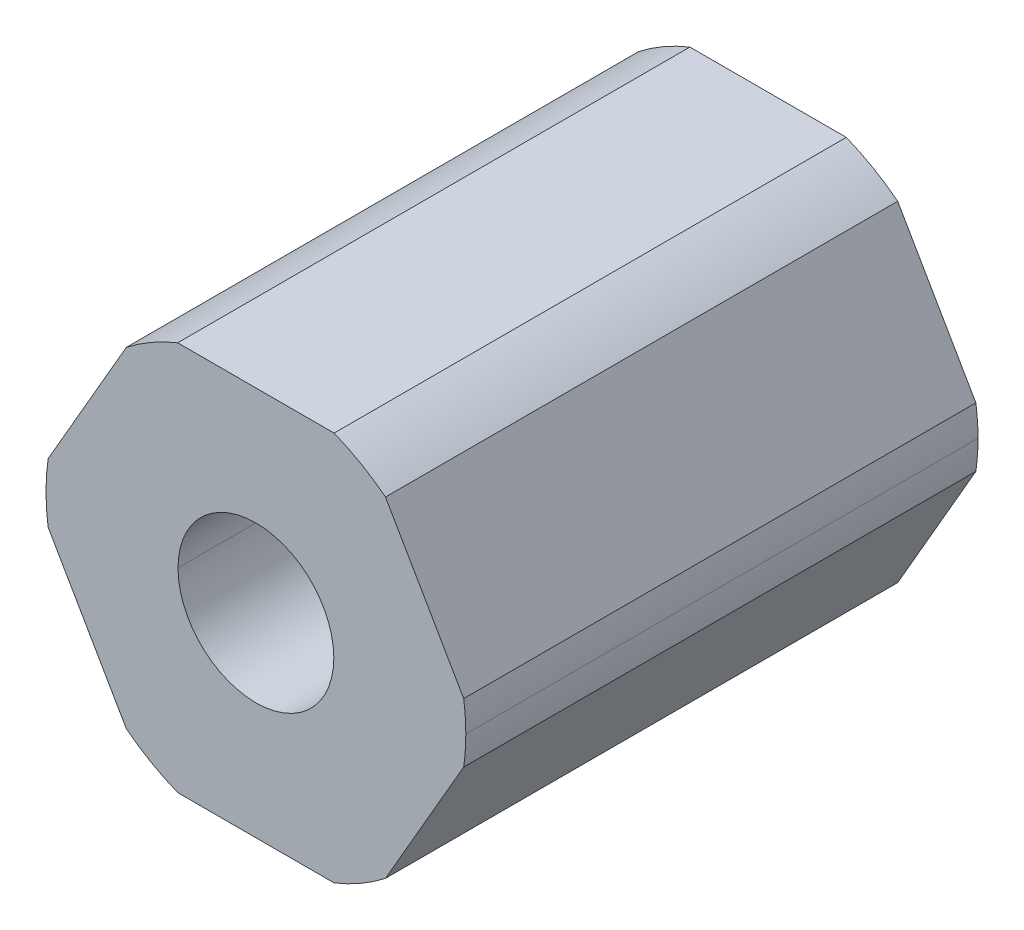
ISO-10303-21;
HEADER;
FILE_DESCRIPTION(('STEP AP214'),'2;1');
FILE_NAME('part.step','',(''),(''),'','','');
FILE_SCHEMA(('AUTOMOTIVE_DESIGN { 1 0 10303 214 1 1 1 1 }'));
ENDSEC;
DATA;
#1=APPLICATION_CONTEXT('core data for automotive mechanical design processes');
#2=APPLICATION_PROTOCOL_DEFINITION('international standard','automotive_design',2000,#1);
#3=PRODUCT_CONTEXT('',#1,'mechanical');
#4=PRODUCT('Part','Part','',(#3));
#5=PRODUCT_RELATED_PRODUCT_CATEGORY('part','',(#4));
#6=PRODUCT_DEFINITION_FORMATION('','',#4);
#7=PRODUCT_DEFINITION_CONTEXT('part definition',#1,'design');
#8=PRODUCT_DEFINITION('design','',#6,#7);
#9=PRODUCT_DEFINITION_SHAPE('','',#8);
#10=(LENGTH_UNIT() NAMED_UNIT(*) SI_UNIT(.MILLI.,.METRE.));
#11=(NAMED_UNIT(*) PLANE_ANGLE_UNIT() SI_UNIT($,.RADIAN.));
#12=(NAMED_UNIT(*) SI_UNIT($,.STERADIAN.) SOLID_ANGLE_UNIT());
#13=UNCERTAINTY_MEASURE_WITH_UNIT(LENGTH_MEASURE(1.E-05),#10,'distance_accuracy_value','');
#14=(GEOMETRIC_REPRESENTATION_CONTEXT(3) GLOBAL_UNCERTAINTY_ASSIGNED_CONTEXT((#13)) GLOBAL_UNIT_ASSIGNED_CONTEXT((#10,
#11,#12)) REPRESENTATION_CONTEXT('',''));
#15=CARTESIAN_POINT('',(0.,0.,0.));
#16=DIRECTION('',(0.,0.,1.));
#17=DIRECTION('',(1.,0.,0.));
#18=AXIS2_PLACEMENT_3D('',#15,#16,#17);
#19=CARTESIAN_POINT('',(0.,0.,-457.2));
#20=DIRECTION('',(0.,0.,1.));
#21=DIRECTION('',(1.,0.,0.));
#22=AXIS2_PLACEMENT_3D('',#19,#20,#21);
#23=CYLINDRICAL_SURFACE('',#22,2.55);
#24=CARTESIAN_POINT('',(0.,0.,-440.436));
#25=DIRECTION('',(0.,0.,1.));
#26=DIRECTION('',(1.,0.,0.));
#27=AXIS2_PLACEMENT_3D('',#24,#25,#26);
#28=CIRCLE('',#27,2.55);
#29=CARTESIAN_POINT('',(2.55,0.,-440.436));
#30=VERTEX_POINT('',#29);
#31=CARTESIAN_POINT('',(-2.55,0.,-440.436));
#32=VERTEX_POINT('',#31);
#33=EDGE_CURVE('E67',#30,#32,#28,.F.);
#34=ORIENTED_EDGE('',*,*,#33,.F.);
#35=DIRECTION('',(0.,0.,1.));
#36=VECTOR('',#35,1.);
#37=CARTESIAN_POINT('',(2.55,0.,-457.2));
#38=LINE('',#37,#36);
#39=CARTESIAN_POINT('',(2.55,0.,-457.2));
#40=VERTEX_POINT('',#39);
#41=EDGE_CURVE('E170',#40,#30,#38,.T.);
#42=ORIENTED_EDGE('',*,*,#41,.F.);
#43=CARTESIAN_POINT('',(0.,0.,-457.2));
#44=DIRECTION('',(0.,0.,1.));
#45=DIRECTION('',(1.,0.,0.));
#46=AXIS2_PLACEMENT_3D('',#43,#44,#45);
#47=CIRCLE('',#46,2.55);
#48=CARTESIAN_POINT('',(-2.55,0.,-457.2));
#49=VERTEX_POINT('',#48);
#50=EDGE_CURVE('E272',#49,#40,#47,.T.);
#51=ORIENTED_EDGE('',*,*,#50,.F.);
#52=DIRECTION('',(0.,0.,1.));
#53=VECTOR('',#52,1.);
#54=CARTESIAN_POINT('',(-2.55,0.,-457.2));
#55=LINE('',#54,#53);
#56=EDGE_CURVE('E54',#49,#32,#55,.T.);
#57=ORIENTED_EDGE('',*,*,#56,.T.);
#58=EDGE_LOOP('',(#34,#42,#51,#57));
#59=FACE_BOUND('',#58,.T.);
#60=ADVANCED_FACE('F46',(#59),#23,.F.);
#61=CARTESIAN_POINT('',(0.,0.,-457.2));
#62=DIRECTION('',(0.,0.,1.));
#63=DIRECTION('',(1.,0.,0.));
#64=AXIS2_PLACEMENT_3D('',#61,#62,#63);
#65=CYLINDRICAL_SURFACE('',#64,6.87);
#66=DIRECTION('',(0.,0.,1.));
#67=VECTOR('',#66,1.);
#68=CARTESIAN_POINT('',(6.87,0.,-457.2));
#69=LINE('',#68,#67);
#70=CARTESIAN_POINT('',(6.87,0.,-457.2));
#71=VERTEX_POINT('',#70);
#72=CARTESIAN_POINT('',(6.87,0.,-440.436));
#73=VERTEX_POINT('',#72);
#74=EDGE_CURVE('E219',#71,#73,#69,.T.);
#75=ORIENTED_EDGE('',*,*,#74,.T.);
#76=CARTESIAN_POINT('',(0.,0.,-440.436));
#77=DIRECTION('',(0.,0.,1.));
#78=DIRECTION('',(1.,0.,0.));
#79=AXIS2_PLACEMENT_3D('',#76,#77,#78);
#80=CIRCLE('',#79,6.87);
#81=CARTESIAN_POINT('',(6.80102150534208,-0.971085209378955,-440.436));
#82=VERTEX_POINT('',#81);
#83=EDGE_CURVE('E333',#73,#82,#80,.F.);
#84=ORIENTED_EDGE('',*,*,#83,.T.);
#85=DIRECTION('',(0.,0.,-1.));
#86=VECTOR('',#85,1.);
#87=CARTESIAN_POINT('',(6.80102150534208,-0.971085209378962,-457.2));
#88=LINE('',#87,#86);
#89=CARTESIAN_POINT('',(6.80102150534208,-0.971085209378955,-457.2));
#90=VERTEX_POINT('',#89);
#91=EDGE_CURVE('E222',#82,#90,#88,.T.);
#92=ORIENTED_EDGE('',*,*,#91,.T.);
#93=CARTESIAN_POINT('',(0.,0.,-457.2));
#94=DIRECTION('',(0.,0.,1.));
#95=DIRECTION('',(1.,0.,0.));
#96=AXIS2_PLACEMENT_3D('',#93,#94,#95);
#97=CIRCLE('',#96,6.87);
#98=EDGE_CURVE('E215',#90,#71,#97,.T.);
#99=ORIENTED_EDGE('',*,*,#98,.T.);
#100=EDGE_LOOP('',(#75,#84,#92,#99));
#101=FACE_BOUND('',#100,.T.);
#102=ADVANCED_FACE('F357',(#101),#65,.T.);
#103=CARTESIAN_POINT('',(3.68083890619154,-6.3754,457.2));
#104=DIRECTION('',(-0.866025403784439,0.5,0.));
#105=DIRECTION('',(0.,0.,1.));
#106=AXIS2_PLACEMENT_3D('',#103,#104,#105);
#107=PLANE('',#106);
#108=DIRECTION('',(0.5,0.866025403784439,0.));
#109=VECTOR('',#108,1.);
#110=CARTESIAN_POINT('',(3.68083890619154,-6.3754,-440.436));
#111=LINE('',#110,#109);
#112=CARTESIAN_POINT('',(4.24149521323254,-5.40431479062105,-440.436));
#113=VERTEX_POINT('',#112);
#114=EDGE_CURVE('E341',#113,#82,#111,.T.);
#115=ORIENTED_EDGE('',*,*,#114,.F.);
#116=DIRECTION('',(0.,0.,1.));
#117=VECTOR('',#116,1.);
#118=CARTESIAN_POINT('',(4.24149521323255,-5.40431479062104,-457.2));
#119=LINE('',#118,#117);
#120=CARTESIAN_POINT('',(4.24149521323254,-5.40431479062105,-457.2));
#121=VERTEX_POINT('',#120);
#122=EDGE_CURVE('E212',#121,#113,#119,.T.);
#123=ORIENTED_EDGE('',*,*,#122,.F.);
#124=DIRECTION('',(0.5,0.866025403784439,0.));
#125=VECTOR('',#124,1.);
#126=CARTESIAN_POINT('',(3.68083890619154,-6.3754,-457.2));
#127=LINE('',#126,#125);
#128=EDGE_CURVE('E240',#121,#90,#127,.T.);
#129=ORIENTED_EDGE('',*,*,#128,.T.);
#130=ORIENTED_EDGE('',*,*,#91,.F.);
#131=EDGE_LOOP('',(#115,#123,#129,#130));
#132=FACE_BOUND('',#131,.T.);
#133=ADVANCED_FACE('F355',(#132),#107,.F.);
#134=CARTESIAN_POINT('',(7.36167781238308,0.,457.2));
#135=DIRECTION('',(-0.866025403784439,-0.5,0.));
#136=DIRECTION('',(-0.5,0.866025403784439,0.));
#137=AXIS2_PLACEMENT_3D('',#134,#135,#136);
#138=PLANE('',#137);
#139=DIRECTION('',(-0.5,0.866025403784439,0.));
#140=VECTOR('',#139,1.);
#141=CARTESIAN_POINT('',(7.36167781238308,0.,-440.436));
#142=LINE('',#141,#140);
#143=CARTESIAN_POINT('',(6.80102150534208,0.97108520937895,-440.436));
#144=VERTEX_POINT('',#143);
#145=CARTESIAN_POINT('',(4.24149521323254,5.40431479062105,-440.436));
#146=VERTEX_POINT('',#145);
#147=EDGE_CURVE('E61',#144,#146,#142,.T.);
#148=ORIENTED_EDGE('',*,*,#147,.F.);
#149=DIRECTION('',(0.,0.,1.));
#150=VECTOR('',#149,1.);
#151=CARTESIAN_POINT('',(6.80102150534208,0.971085209378949,-457.2));
#152=LINE('',#151,#150);
#153=CARTESIAN_POINT('',(6.80102150534208,0.97108520937895,-457.2));
#154=VERTEX_POINT('',#153);
#155=EDGE_CURVE('E207',#154,#144,#152,.T.);
#156=ORIENTED_EDGE('',*,*,#155,.F.);
#157=DIRECTION('',(-0.5,0.866025403784439,0.));
#158=VECTOR('',#157,1.);
#159=CARTESIAN_POINT('',(7.36167781238308,0.,-457.2));
#160=LINE('',#159,#158);
#161=CARTESIAN_POINT('',(4.24149521323254,5.40431479062105,-457.2));
#162=VERTEX_POINT('',#161);
#163=EDGE_CURVE('E203',#154,#162,#160,.T.);
#164=ORIENTED_EDGE('',*,*,#163,.T.);
#165=DIRECTION('',(0.,0.,-1.));
#166=VECTOR('',#165,1.);
#167=CARTESIAN_POINT('',(4.24149521323254,5.40431479062105,-457.2));
#168=LINE('',#167,#166);
#169=EDGE_CURVE('E216',#146,#162,#168,.T.);
#170=ORIENTED_EDGE('',*,*,#169,.F.);
#171=EDGE_LOOP('',(#148,#156,#164,#170));
#172=FACE_BOUND('',#171,.T.);
#173=ADVANCED_FACE('F312',(#172),#138,.F.);
#174=CARTESIAN_POINT('',(3.68083890619154,6.3754,457.2));
#175=DIRECTION('',(0.,-1.,0.));
#176=DIRECTION('',(0.,0.,-1.));
#177=AXIS2_PLACEMENT_3D('',#174,#175,#176);
#178=PLANE('',#177);
#179=DIRECTION('',(-1.,0.,0.));
#180=VECTOR('',#179,1.);
#181=CARTESIAN_POINT('',(3.68083890619154,6.3754,-440.436));
#182=LINE('',#181,#180);
#183=CARTESIAN_POINT('',(2.55952629210953,6.3754,-440.436));
#184=VERTEX_POINT('',#183);
#185=CARTESIAN_POINT('',(-2.55952629210953,6.3754,-440.436));
#186=VERTEX_POINT('',#185);
#187=EDGE_CURVE('E321',#184,#186,#182,.T.);
#188=ORIENTED_EDGE('',*,*,#187,.F.);
#189=DIRECTION('',(0.,0.,1.));
#190=VECTOR('',#189,1.);
#191=CARTESIAN_POINT('',(2.55952629210952,6.3754,-457.2));
#192=LINE('',#191,#190);
#193=CARTESIAN_POINT('',(2.55952629210952,6.3754,-457.2));
#194=VERTEX_POINT('',#193);
#195=EDGE_CURVE('E179',#194,#184,#192,.T.);
#196=ORIENTED_EDGE('',*,*,#195,.F.);
#197=DIRECTION('',(-1.,0.,0.));
#198=VECTOR('',#197,1.);
#199=CARTESIAN_POINT('',(3.68083890619154,6.3754,-457.2));
#200=LINE('',#199,#198);
#201=CARTESIAN_POINT('',(-2.55952629210953,6.3754,-457.2));
#202=VERTEX_POINT('',#201);
#203=EDGE_CURVE('E199',#194,#202,#200,.T.);
#204=ORIENTED_EDGE('',*,*,#203,.T.);
#205=DIRECTION('',(0.,0.,-1.));
#206=VECTOR('',#205,1.);
#207=CARTESIAN_POINT('',(-2.55952629210953,6.3754,-457.2));
#208=LINE('',#207,#206);
#209=EDGE_CURVE('E198',#186,#202,#208,.T.);
#210=ORIENTED_EDGE('',*,*,#209,.F.);
#211=EDGE_LOOP('',(#188,#196,#204,#210));
#212=FACE_BOUND('',#211,.T.);
#213=ADVANCED_FACE('F48',(#212),#178,.F.);
#214=CARTESIAN_POINT('',(-3.68083890619154,6.3754,457.2));
#215=DIRECTION('',(0.866025403784439,-0.5,0.));
#216=DIRECTION('',(0.,0.,-1.));
#217=AXIS2_PLACEMENT_3D('',#214,#215,#216);
#218=PLANE('',#217);
#219=DIRECTION('',(-0.5,-0.866025403784439,0.));
#220=VECTOR('',#219,1.);
#221=CARTESIAN_POINT('',(-3.68083890619154,6.3754,-440.436));
#222=LINE('',#221,#220);
#223=CARTESIAN_POINT('',(-4.24149521323255,5.40431479062105,-440.436));
#224=VERTEX_POINT('',#223);
#225=CARTESIAN_POINT('',(-6.80102150534207,0.97108520937896,-440.436));
#226=VERTEX_POINT('',#225);
#227=EDGE_CURVE('E331',#224,#226,#222,.T.);
#228=ORIENTED_EDGE('',*,*,#227,.F.);
#229=DIRECTION('',(0.,0.,1.));
#230=VECTOR('',#229,1.);
#231=CARTESIAN_POINT('',(-4.24149521323255,5.40431479062105,-457.2));
#232=LINE('',#231,#230);
#233=CARTESIAN_POINT('',(-4.24149521323255,5.40431479062105,-457.2));
#234=VERTEX_POINT('',#233);
#235=EDGE_CURVE('E218',#234,#224,#232,.T.);
#236=ORIENTED_EDGE('',*,*,#235,.F.);
#237=DIRECTION('',(-0.5,-0.866025403784439,0.));
#238=VECTOR('',#237,1.);
#239=CARTESIAN_POINT('',(-3.68083890619154,6.3754,-457.2));
#240=LINE('',#239,#238);
#241=CARTESIAN_POINT('',(-6.80102150534208,0.97108520937896,-457.2));
#242=VERTEX_POINT('',#241);
#243=EDGE_CURVE('E204',#234,#242,#240,.T.);
#244=ORIENTED_EDGE('',*,*,#243,.T.);
#245=DIRECTION('',(0.,0.,-1.));
#246=VECTOR('',#245,1.);
#247=CARTESIAN_POINT('',(-6.80102150534208,0.97108520937896,-457.2));
#248=LINE('',#247,#246);
#249=EDGE_CURVE('E278',#226,#242,#248,.T.);
#250=ORIENTED_EDGE('',*,*,#249,.F.);
#251=EDGE_LOOP('',(#228,#236,#244,#250));
#252=FACE_BOUND('',#251,.T.);
#253=ADVANCED_FACE('F401',(#252),#218,.F.);
#254=CARTESIAN_POINT('',(-7.36167781238308,0.,457.2));
#255=DIRECTION('',(0.866025403784439,0.5,0.));
#256=DIRECTION('',(0.,0.,-1.));
#257=AXIS2_PLACEMENT_3D('',#254,#255,#256);
#258=PLANE('',#257);
#259=DIRECTION('',(0.5,-0.866025403784439,0.));
#260=VECTOR('',#259,1.);
#261=CARTESIAN_POINT('',(-7.36167781238308,0.,-440.436));
#262=LINE('',#261,#260);
#263=CARTESIAN_POINT('',(-6.80102150534208,-0.971085209378956,-440.436));
#264=VERTEX_POINT('',#263);
#265=CARTESIAN_POINT('',(-4.24149521323254,-5.40431479062105,-440.436));
#266=VERTEX_POINT('',#265);
#267=EDGE_CURVE('E339',#264,#266,#262,.T.);
#268=ORIENTED_EDGE('',*,*,#267,.F.);
#269=DIRECTION('',(0.,0.,1.));
#270=VECTOR('',#269,1.);
#271=CARTESIAN_POINT('',(-6.80102150534208,-0.971085209378962,-457.2));
#272=LINE('',#271,#270);
#273=CARTESIAN_POINT('',(-6.80102150534208,-0.971085209378956,-457.2));
#274=VERTEX_POINT('',#273);
#275=EDGE_CURVE('E194',#274,#264,#272,.T.);
#276=ORIENTED_EDGE('',*,*,#275,.F.);
#277=DIRECTION('',(0.5,-0.866025403784439,0.));
#278=VECTOR('',#277,1.);
#279=CARTESIAN_POINT('',(-7.36167781238308,0.,-457.2));
#280=LINE('',#279,#278);
#281=CARTESIAN_POINT('',(-4.24149521323254,-5.40431479062105,-457.2));
#282=VERTEX_POINT('',#281);
#283=EDGE_CURVE('E254',#274,#282,#280,.T.);
#284=ORIENTED_EDGE('',*,*,#283,.T.);
#285=DIRECTION('',(0.,0.,-1.));
#286=VECTOR('',#285,1.);
#287=CARTESIAN_POINT('',(-4.24149521323255,-5.40431479062104,-457.2));
#288=LINE('',#287,#286);
#289=EDGE_CURVE('E247',#266,#282,#288,.T.);
#290=ORIENTED_EDGE('',*,*,#289,.F.);
#291=EDGE_LOOP('',(#268,#276,#284,#290));
#292=FACE_BOUND('',#291,.T.);
#293=ADVANCED_FACE('F366',(#292),#258,.F.);
#294=CARTESIAN_POINT('',(-3.68083890619154,-6.3754,457.2));
#295=DIRECTION('',(0.,1.,0.));
#296=DIRECTION('',(1.,0.,0.));
#297=AXIS2_PLACEMENT_3D('',#294,#295,#296);
#298=PLANE('',#297);
#299=DIRECTION('',(1.,0.,0.));
#300=VECTOR('',#299,1.);
#301=CARTESIAN_POINT('',(-3.68083890619154,-6.3754,-440.436));
#302=LINE('',#301,#300);
#303=CARTESIAN_POINT('',(-2.55952629210953,-6.3754,-440.436));
#304=VERTEX_POINT('',#303);
#305=CARTESIAN_POINT('',(2.55952629210953,-6.3754,-440.436));
#306=VERTEX_POINT('',#305);
#307=EDGE_CURVE('E180',#304,#306,#302,.T.);
#308=ORIENTED_EDGE('',*,*,#307,.F.);
#309=DIRECTION('',(0.,0.,1.));
#310=VECTOR('',#309,1.);
#311=CARTESIAN_POINT('',(-2.55952629210953,-6.3754,-457.2));
#312=LINE('',#311,#310);
#313=CARTESIAN_POINT('',(-2.55952629210953,-6.3754,-457.2));
#314=VERTEX_POINT('',#313);
#315=EDGE_CURVE('E248',#314,#304,#312,.T.);
#316=ORIENTED_EDGE('',*,*,#315,.F.);
#317=DIRECTION('',(1.,0.,0.));
#318=VECTOR('',#317,1.);
#319=CARTESIAN_POINT('',(-3.68083890619154,-6.3754,-457.2));
#320=LINE('',#319,#318);
#321=CARTESIAN_POINT('',(2.55952629210953,-6.3754,-457.2));
#322=VERTEX_POINT('',#321);
#323=EDGE_CURVE('E257',#314,#322,#320,.T.);
#324=ORIENTED_EDGE('',*,*,#323,.T.);
#325=DIRECTION('',(0.,0.,-1.));
#326=VECTOR('',#325,1.);
#327=CARTESIAN_POINT('',(2.55952629210953,-6.3754,-457.2));
#328=LINE('',#327,#326);
#329=EDGE_CURVE('E291',#306,#322,#328,.T.);
#330=ORIENTED_EDGE('',*,*,#329,.F.);
#331=EDGE_LOOP('',(#308,#316,#324,#330));
#332=FACE_BOUND('',#331,.T.);
#333=ADVANCED_FACE('F348',(#332),#298,.F.);
#334=CARTESIAN_POINT('',(0.,0.,-457.2));
#335=DIRECTION('',(0.,0.,1.));
#336=DIRECTION('',(1.,0.,0.));
#337=AXIS2_PLACEMENT_3D('',#334,#335,#336);
#338=CYLINDRICAL_SURFACE('',#337,6.87);
#339=ORIENTED_EDGE('',*,*,#155,.T.);
#340=CARTESIAN_POINT('',(0.,0.,-440.436));
#341=DIRECTION('',(0.,0.,1.));
#342=DIRECTION('',(1.,0.,0.));
#343=AXIS2_PLACEMENT_3D('',#340,#341,#342);
#344=CIRCLE('',#343,6.87);
#345=EDGE_CURVE('E328',#144,#73,#344,.F.);
#346=ORIENTED_EDGE('',*,*,#345,.T.);
#347=ORIENTED_EDGE('',*,*,#74,.F.);
#348=CARTESIAN_POINT('',(0.,0.,-457.2));
#349=DIRECTION('',(0.,0.,1.));
#350=DIRECTION('',(1.,0.,0.));
#351=AXIS2_PLACEMENT_3D('',#348,#349,#350);
#352=CIRCLE('',#351,6.87);
#353=EDGE_CURVE('E211',#71,#154,#352,.T.);
#354=ORIENTED_EDGE('',*,*,#353,.T.);
#355=EDGE_LOOP('',(#339,#346,#347,#354));
#356=FACE_BOUND('',#355,.T.);
#357=ADVANCED_FACE('F358',(#356),#338,.T.);
#358=CARTESIAN_POINT('',(0.,0.,-457.2));
#359=DIRECTION('',(0.,0.,1.));
#360=DIRECTION('',(1.,0.,0.));
#361=AXIS2_PLACEMENT_3D('',#358,#359,#360);
#362=CYLINDRICAL_SURFACE('',#361,6.87);
#363=ORIENTED_EDGE('',*,*,#122,.T.);
#364=CARTESIAN_POINT('',(0.,0.,-440.436));
#365=DIRECTION('',(0.,0.,1.));
#366=DIRECTION('',(1.,0.,0.));
#367=AXIS2_PLACEMENT_3D('',#364,#365,#366);
#368=CIRCLE('',#367,6.87);
#369=EDGE_CURVE('E189',#113,#306,#368,.F.);
#370=ORIENTED_EDGE('',*,*,#369,.T.);
#371=ORIENTED_EDGE('',*,*,#329,.T.);
#372=CARTESIAN_POINT('',(0.,0.,-457.2));
#373=DIRECTION('',(0.,0.,1.));
#374=DIRECTION('',(1.,0.,0.));
#375=AXIS2_PLACEMENT_3D('',#372,#373,#374);
#376=CIRCLE('',#375,6.87);
#377=EDGE_CURVE('E238',#322,#121,#376,.T.);
#378=ORIENTED_EDGE('',*,*,#377,.T.);
#379=EDGE_LOOP('',(#363,#370,#371,#378));
#380=FACE_BOUND('',#379,.T.);
#381=ADVANCED_FACE('F345',(#380),#362,.T.);
#382=CARTESIAN_POINT('',(0.,0.,-457.2));
#383=DIRECTION('',(0.,0.,1.));
#384=DIRECTION('',(1.,0.,0.));
#385=AXIS2_PLACEMENT_3D('',#382,#383,#384);
#386=CYLINDRICAL_SURFACE('',#385,6.87);
#387=ORIENTED_EDGE('',*,*,#315,.T.);
#388=CARTESIAN_POINT('',(0.,0.,-440.436));
#389=DIRECTION('',(0.,0.,1.));
#390=DIRECTION('',(1.,0.,0.));
#391=AXIS2_PLACEMENT_3D('',#388,#389,#390);
#392=CIRCLE('',#391,6.87);
#393=EDGE_CURVE('E343',#304,#266,#392,.F.);
#394=ORIENTED_EDGE('',*,*,#393,.T.);
#395=ORIENTED_EDGE('',*,*,#289,.T.);
#396=CARTESIAN_POINT('',(0.,0.,-457.2));
#397=DIRECTION('',(0.,0.,1.));
#398=DIRECTION('',(1.,0.,0.));
#399=AXIS2_PLACEMENT_3D('',#396,#397,#398);
#400=CIRCLE('',#399,6.87);
#401=EDGE_CURVE('E243',#282,#314,#400,.T.);
#402=ORIENTED_EDGE('',*,*,#401,.T.);
#403=EDGE_LOOP('',(#387,#394,#395,#402));
#404=FACE_BOUND('',#403,.T.);
#405=ADVANCED_FACE('F349',(#404),#386,.T.);
#406=CARTESIAN_POINT('',(0.,0.,-457.2));
#407=DIRECTION('',(0.,0.,1.));
#408=DIRECTION('',(1.,0.,0.));
#409=AXIS2_PLACEMENT_3D('',#406,#407,#408);
#410=CYLINDRICAL_SURFACE('',#409,6.87);
#411=ORIENTED_EDGE('',*,*,#275,.T.);
#412=CARTESIAN_POINT('',(0.,0.,-440.436));
#413=DIRECTION('',(0.,0.,1.));
#414=DIRECTION('',(1.,0.,0.));
#415=AXIS2_PLACEMENT_3D('',#412,#413,#414);
#416=CIRCLE('',#415,6.87);
#417=EDGE_CURVE('E336',#264,#226,#416,.F.);
#418=ORIENTED_EDGE('',*,*,#417,.T.);
#419=ORIENTED_EDGE('',*,*,#249,.T.);
#420=CARTESIAN_POINT('',(0.,0.,-457.2));
#421=DIRECTION('',(0.,0.,1.));
#422=DIRECTION('',(1.,0.,0.));
#423=AXIS2_PLACEMENT_3D('',#420,#421,#422);
#424=CIRCLE('',#423,6.87);
#425=EDGE_CURVE('E197',#242,#274,#424,.T.);
#426=ORIENTED_EDGE('',*,*,#425,.T.);
#427=EDGE_LOOP('',(#411,#418,#419,#426));
#428=FACE_BOUND('',#427,.T.);
#429=ADVANCED_FACE('F390',(#428),#410,.T.);
#430=CARTESIAN_POINT('',(0.,0.,-457.2));
#431=DIRECTION('',(0.,0.,1.));
#432=DIRECTION('',(1.,0.,0.));
#433=AXIS2_PLACEMENT_3D('',#430,#431,#432);
#434=CYLINDRICAL_SURFACE('',#433,6.87);
#435=ORIENTED_EDGE('',*,*,#235,.T.);
#436=CARTESIAN_POINT('',(0.,0.,-440.436));
#437=DIRECTION('',(0.,0.,1.));
#438=DIRECTION('',(1.,0.,0.));
#439=AXIS2_PLACEMENT_3D('',#436,#437,#438);
#440=CIRCLE('',#439,6.87);
#441=EDGE_CURVE('E326',#224,#186,#440,.F.);
#442=ORIENTED_EDGE('',*,*,#441,.T.);
#443=ORIENTED_EDGE('',*,*,#209,.T.);
#444=CARTESIAN_POINT('',(0.,0.,-457.2));
#445=DIRECTION('',(0.,0.,1.));
#446=DIRECTION('',(1.,0.,0.));
#447=AXIS2_PLACEMENT_3D('',#444,#445,#446);
#448=CIRCLE('',#447,6.87);
#449=EDGE_CURVE('E206',#202,#234,#448,.T.);
#450=ORIENTED_EDGE('',*,*,#449,.T.);
#451=EDGE_LOOP('',(#435,#442,#443,#450));
#452=FACE_BOUND('',#451,.T.);
#453=ADVANCED_FACE('F386',(#452),#434,.T.);
#454=CARTESIAN_POINT('',(0.,0.,-457.2));
#455=DIRECTION('',(0.,0.,1.));
#456=DIRECTION('',(1.,0.,0.));
#457=AXIS2_PLACEMENT_3D('',#454,#455,#456);
#458=CYLINDRICAL_SURFACE('',#457,6.87);
#459=ORIENTED_EDGE('',*,*,#195,.T.);
#460=CARTESIAN_POINT('',(0.,0.,-440.436));
#461=DIRECTION('',(0.,0.,1.));
#462=DIRECTION('',(1.,0.,0.));
#463=AXIS2_PLACEMENT_3D('',#460,#461,#462);
#464=CIRCLE('',#463,6.87);
#465=EDGE_CURVE('E172',#184,#146,#464,.F.);
#466=ORIENTED_EDGE('',*,*,#465,.T.);
#467=ORIENTED_EDGE('',*,*,#169,.T.);
#468=CARTESIAN_POINT('',(0.,0.,-457.2));
#469=DIRECTION('',(0.,0.,1.));
#470=DIRECTION('',(1.,0.,0.));
#471=AXIS2_PLACEMENT_3D('',#468,#469,#470);
#472=CIRCLE('',#471,6.87);
#473=EDGE_CURVE('E187',#162,#194,#472,.T.);
#474=ORIENTED_EDGE('',*,*,#473,.T.);
#475=EDGE_LOOP('',(#459,#466,#467,#474));
#476=FACE_BOUND('',#475,.T.);
#477=ADVANCED_FACE('F319',(#476),#458,.T.);
#478=CARTESIAN_POINT('',(0.,0.,-457.2));
#479=DIRECTION('',(0.,0.,1.));
#480=DIRECTION('',(1.,0.,0.));
#481=AXIS2_PLACEMENT_3D('',#478,#479,#480);
#482=CYLINDRICAL_SURFACE('',#481,2.55);
#483=CARTESIAN_POINT('',(0.,0.,-440.436));
#484=DIRECTION('',(0.,0.,1.));
#485=DIRECTION('',(1.,0.,0.));
#486=AXIS2_PLACEMENT_3D('',#483,#484,#485);
#487=CIRCLE('',#486,2.55);
#488=EDGE_CURVE('E11',#32,#30,#487,.F.);
#489=ORIENTED_EDGE('',*,*,#488,.F.);
#490=ORIENTED_EDGE('',*,*,#56,.F.);
#491=CARTESIAN_POINT('',(0.,0.,-457.2));
#492=DIRECTION('',(0.,0.,1.));
#493=DIRECTION('',(1.,0.,0.));
#494=AXIS2_PLACEMENT_3D('',#491,#492,#493);
#495=CIRCLE('',#494,2.55);
#496=EDGE_CURVE('E177',#40,#49,#495,.T.);
#497=ORIENTED_EDGE('',*,*,#496,.F.);
#498=ORIENTED_EDGE('',*,*,#41,.T.);
#499=EDGE_LOOP('',(#489,#490,#497,#498));
#500=FACE_BOUND('',#499,.T.);
#501=ADVANCED_FACE('F175',(#500),#482,.F.);
#502=CARTESIAN_POINT('',(0.,0.,-457.2));
#503=DIRECTION('',(0.,0.,1.));
#504=DIRECTION('',(1.,0.,0.));
#505=AXIS2_PLACEMENT_3D('',#502,#503,#504);
#506=PLANE('',#505);
#507=ORIENTED_EDGE('',*,*,#473,.F.);
#508=ORIENTED_EDGE('',*,*,#163,.F.);
#509=ORIENTED_EDGE('',*,*,#353,.F.);
#510=ORIENTED_EDGE('',*,*,#98,.F.);
#511=ORIENTED_EDGE('',*,*,#128,.F.);
#512=ORIENTED_EDGE('',*,*,#377,.F.);
#513=ORIENTED_EDGE('',*,*,#323,.F.);
#514=ORIENTED_EDGE('',*,*,#401,.F.);
#515=ORIENTED_EDGE('',*,*,#283,.F.);
#516=ORIENTED_EDGE('',*,*,#425,.F.);
#517=ORIENTED_EDGE('',*,*,#243,.F.);
#518=ORIENTED_EDGE('',*,*,#449,.F.);
#519=ORIENTED_EDGE('',*,*,#203,.F.);
#520=EDGE_LOOP('',(#507,#508,#509,#510,#511,#512,#513,#514,#515,#516,#517,#518,#519));
#521=FACE_BOUND('',#520,.T.);
#522=ORIENTED_EDGE('',*,*,#496,.T.);
#523=ORIENTED_EDGE('',*,*,#50,.T.);
#524=EDGE_LOOP('',(#522,#523));
#525=FACE_BOUND('',#524,.T.);
#526=ADVANCED_FACE('F316',(#521,#525),#506,.F.);
#527=CARTESIAN_POINT('',(-0.121695313577346,-0.660631702273817,-440.436));
#528=DIRECTION('',(0.,0.,1.));
#529=DIRECTION('',(1.,0.,0.));
#530=AXIS2_PLACEMENT_3D('',#527,#528,#529);
#531=PLANE('',#530);
#532=ORIENTED_EDGE('',*,*,#33,.T.);
#533=ORIENTED_EDGE('',*,*,#488,.T.);
#534=EDGE_LOOP('',(#532,#533));
#535=FACE_BOUND('',#534,.T.);
#536=ORIENTED_EDGE('',*,*,#307,.T.);
#537=ORIENTED_EDGE('',*,*,#369,.F.);
#538=ORIENTED_EDGE('',*,*,#114,.T.);
#539=ORIENTED_EDGE('',*,*,#83,.F.);
#540=ORIENTED_EDGE('',*,*,#345,.F.);
#541=ORIENTED_EDGE('',*,*,#147,.T.);
#542=ORIENTED_EDGE('',*,*,#465,.F.);
#543=ORIENTED_EDGE('',*,*,#187,.T.);
#544=ORIENTED_EDGE('',*,*,#441,.F.);
#545=ORIENTED_EDGE('',*,*,#227,.T.);
#546=ORIENTED_EDGE('',*,*,#417,.F.);
#547=ORIENTED_EDGE('',*,*,#267,.T.);
#548=ORIENTED_EDGE('',*,*,#393,.F.);
#549=EDGE_LOOP('',(#536,#537,#538,#539,#540,#541,#542,#543,#544,#545,#546,#547,#548));
#550=FACE_BOUND('',#549,.T.);
#551=ADVANCED_FACE('F164',(#535,#550),#531,.T.);
#552=CLOSED_SHELL('',(#60,#102,#133,#173,#213,#253,#293,#333,#357,#381,#405,#429,#453,#477,#501,
#526,#551));
#553=MANIFOLD_SOLID_BREP('B2',#552);
#554=ADVANCED_BREP_SHAPE_REPRESENTATION('',(#18,#553),#14);
#555=SHAPE_DEFINITION_REPRESENTATION(#9,#554);
ENDSEC;
END-ISO-10303-21;
